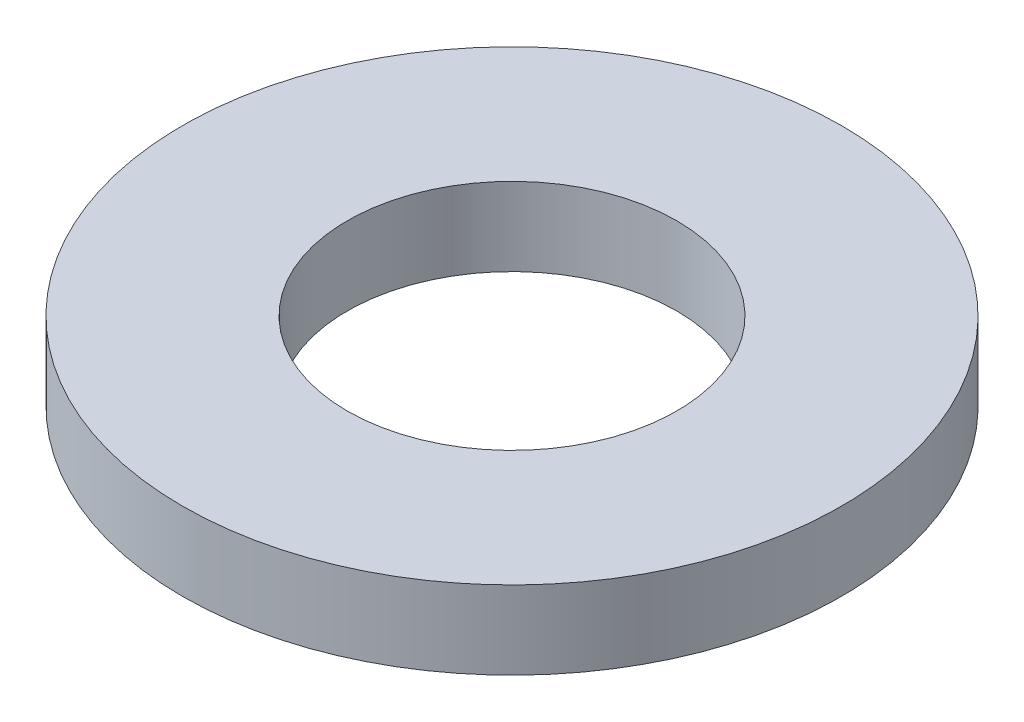
ISO-10303-21;
HEADER;
FILE_DESCRIPTION(('STEP AP214'),'2;1');
FILE_NAME('part.step','',(''),(''),'','','');
FILE_SCHEMA(('AUTOMOTIVE_DESIGN { 1 0 10303 214 1 1 1 1 }'));
ENDSEC;
DATA;
#1=APPLICATION_CONTEXT('core data for automotive mechanical design processes');
#2=APPLICATION_PROTOCOL_DEFINITION('international standard','automotive_design',2000,#1);
#3=PRODUCT_CONTEXT('',#1,'mechanical');
#4=PRODUCT('Part','Part','',(#3));
#5=PRODUCT_RELATED_PRODUCT_CATEGORY('part','',(#4));
#6=PRODUCT_DEFINITION_FORMATION('','',#4);
#7=PRODUCT_DEFINITION_CONTEXT('part definition',#1,'design');
#8=PRODUCT_DEFINITION('design','',#6,#7);
#9=PRODUCT_DEFINITION_SHAPE('','',#8);
#10=(LENGTH_UNIT() NAMED_UNIT(*) SI_UNIT(.MILLI.,.METRE.));
#11=(NAMED_UNIT(*) PLANE_ANGLE_UNIT() SI_UNIT($,.RADIAN.));
#12=(NAMED_UNIT(*) SI_UNIT($,.STERADIAN.) SOLID_ANGLE_UNIT());
#13=UNCERTAINTY_MEASURE_WITH_UNIT(LENGTH_MEASURE(1.E-05),#10,'distance_accuracy_value','');
#14=(GEOMETRIC_REPRESENTATION_CONTEXT(3) GLOBAL_UNCERTAINTY_ASSIGNED_CONTEXT((#13)) GLOBAL_UNIT_ASSIGNED_CONTEXT((#10,
#11,#12)) REPRESENTATION_CONTEXT('',''));
#15=CARTESIAN_POINT('',(0.,0.,0.));
#16=DIRECTION('',(0.,0.,1.));
#17=DIRECTION('',(1.,0.,0.));
#18=AXIS2_PLACEMENT_3D('',#15,#16,#17);
#19=CARTESIAN_POINT('',(0.,0.939800000000005,0.));
#20=DIRECTION('',(0.,-1.,0.));
#21=DIRECTION('',(0.,0.,-1.));
#22=AXIS2_PLACEMENT_3D('',#19,#20,#21);
#23=CYLINDRICAL_SURFACE('',#22,3.9624);
#24=CARTESIAN_POINT('',(0.,0.939800000000005,0.));
#25=DIRECTION('',(0.,1.,0.));
#26=DIRECTION('',(0.,0.,1.));
#27=AXIS2_PLACEMENT_3D('',#24,#25,#26);
#28=CIRCLE('',#27,3.9624);
#29=CARTESIAN_POINT('',(0.,0.939800000000006,3.96240000000002));
#30=VERTEX_POINT('',#29);
#31=EDGE_CURVE('E12',#30,#30,#28,.T.);
#32=ORIENTED_EDGE('',*,*,#31,.F.);
#33=EDGE_LOOP('',(#32));
#34=FACE_BOUND('',#33,.T.);
#35=CARTESIAN_POINT('',(0.,0.,0.));
#36=DIRECTION('',(0.,1.,0.));
#37=DIRECTION('',(0.,0.,1.));
#38=AXIS2_PLACEMENT_3D('',#35,#36,#37);
#39=CIRCLE('',#38,3.9624);
#40=CARTESIAN_POINT('',(0.,0.,3.96240000000001));
#41=VERTEX_POINT('',#40);
#42=EDGE_CURVE('E47',#41,#41,#39,.T.);
#43=ORIENTED_EDGE('',*,*,#42,.T.);
#44=EDGE_LOOP('',(#43));
#45=FACE_BOUND('',#44,.T.);
#46=ADVANCED_FACE('F44',(#34,#45),#23,.T.);
#47=CARTESIAN_POINT('',(0.,0.939800000000005,0.));
#48=DIRECTION('',(0.,1.,0.));
#49=DIRECTION('',(0.,0.,1.));
#50=AXIS2_PLACEMENT_3D('',#47,#48,#49);
#51=PLANE('',#50);
#52=CARTESIAN_POINT('',(0.,0.939800000000005,0.));
#53=DIRECTION('',(0.,1.,0.));
#54=DIRECTION('',(0.,0.,1.));
#55=AXIS2_PLACEMENT_3D('',#52,#53,#54);
#56=CIRCLE('',#55,1.9812);
#57=CARTESIAN_POINT('',(0.,0.939800000000005,1.98120000000002));
#58=VERTEX_POINT('',#57);
#59=EDGE_CURVE('E56',#58,#58,#56,.T.);
#60=ORIENTED_EDGE('',*,*,#59,.F.);
#61=EDGE_LOOP('',(#60));
#62=FACE_BOUND('',#61,.T.);
#63=ORIENTED_EDGE('',*,*,#31,.T.);
#64=EDGE_LOOP('',(#63));
#65=FACE_BOUND('',#64,.T.);
#66=ADVANCED_FACE('F71',(#62,#65),#51,.T.);
#67=CARTESIAN_POINT('',(0.,0.,0.));
#68=DIRECTION('',(0.,1.,0.));
#69=DIRECTION('',(0.,0.,1.));
#70=AXIS2_PLACEMENT_3D('',#67,#68,#69);
#71=PLANE('',#70);
#72=CARTESIAN_POINT('',(0.,0.,0.));
#73=DIRECTION('',(0.,1.,0.));
#74=DIRECTION('',(0.,0.,1.));
#75=AXIS2_PLACEMENT_3D('',#72,#73,#74);
#76=CIRCLE('',#75,1.9812);
#77=CARTESIAN_POINT('',(0.,0.,1.9812));
#78=VERTEX_POINT('',#77);
#79=EDGE_CURVE('E54',#78,#78,#76,.T.);
#80=ORIENTED_EDGE('',*,*,#79,.T.);
#81=EDGE_LOOP('',(#80));
#82=FACE_BOUND('',#81,.T.);
#83=ORIENTED_EDGE('',*,*,#42,.F.);
#84=EDGE_LOOP('',(#83));
#85=FACE_BOUND('',#84,.T.);
#86=ADVANCED_FACE('F62',(#82,#85),#71,.F.);
#87=CARTESIAN_POINT('',(0.,0.,0.));
#88=DIRECTION('',(0.,1.,0.));
#89=DIRECTION('',(0.,0.,1.));
#90=AXIS2_PLACEMENT_3D('',#87,#88,#89);
#91=CYLINDRICAL_SURFACE('',#90,1.9812);
#92=ORIENTED_EDGE('',*,*,#79,.F.);
#93=EDGE_LOOP('',(#92));
#94=FACE_BOUND('',#93,.T.);
#95=ORIENTED_EDGE('',*,*,#59,.T.);
#96=EDGE_LOOP('',(#95));
#97=FACE_BOUND('',#96,.T.);
#98=ADVANCED_FACE('F65',(#94,#97),#91,.F.);
#99=CLOSED_SHELL('',(#46,#66,#86,#98));
#100=MANIFOLD_SOLID_BREP('B2',#99);
#101=ADVANCED_BREP_SHAPE_REPRESENTATION('',(#18,#100),#14);
#102=SHAPE_DEFINITION_REPRESENTATION(#9,#101);
ENDSEC;
END-ISO-10303-21;
